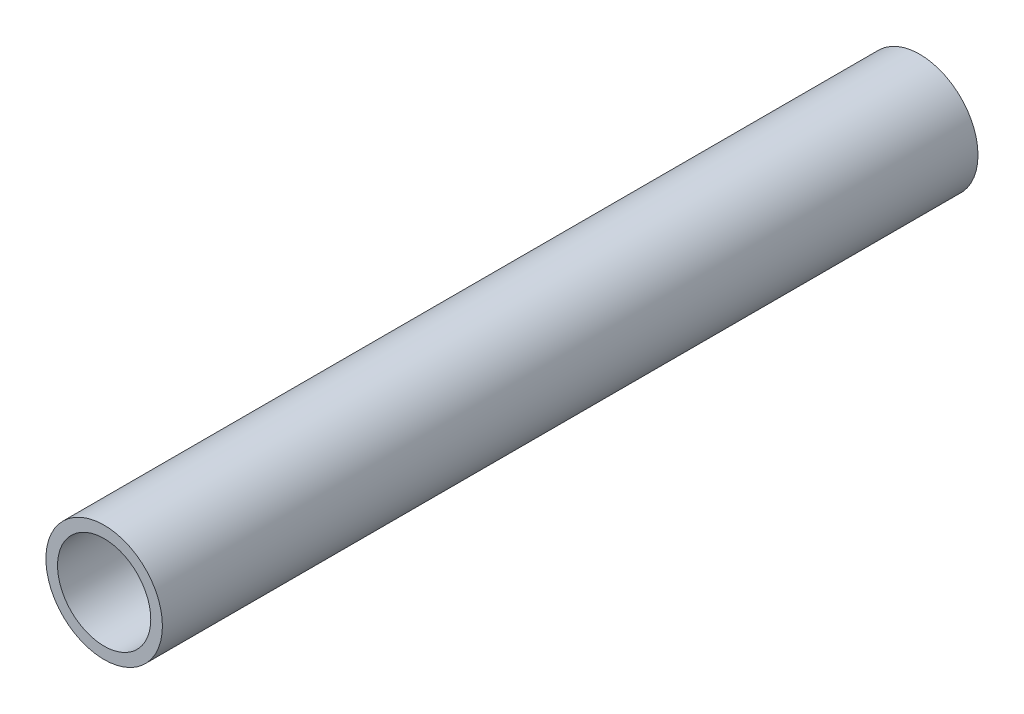
ISO-10303-21;
HEADER;
FILE_DESCRIPTION(('STEP AP214'),'2;1');
FILE_NAME('part.step','',(''),(''),'','','');
FILE_SCHEMA(('AUTOMOTIVE_DESIGN { 1 0 10303 214 1 1 1 1 }'));
ENDSEC;
DATA;
#1=APPLICATION_CONTEXT('core data for automotive mechanical design processes');
#2=APPLICATION_PROTOCOL_DEFINITION('international standard','automotive_design',2000,#1);
#3=PRODUCT_CONTEXT('',#1,'mechanical');
#4=PRODUCT('Part','Part','',(#3));
#5=PRODUCT_RELATED_PRODUCT_CATEGORY('part','',(#4));
#6=PRODUCT_DEFINITION_FORMATION('','',#4);
#7=PRODUCT_DEFINITION_CONTEXT('part definition',#1,'design');
#8=PRODUCT_DEFINITION('design','',#6,#7);
#9=PRODUCT_DEFINITION_SHAPE('','',#8);
#10=(LENGTH_UNIT() NAMED_UNIT(*) SI_UNIT(.MILLI.,.METRE.));
#11=(NAMED_UNIT(*) PLANE_ANGLE_UNIT() SI_UNIT($,.RADIAN.));
#12=(NAMED_UNIT(*) SI_UNIT($,.STERADIAN.) SOLID_ANGLE_UNIT());
#13=UNCERTAINTY_MEASURE_WITH_UNIT(LENGTH_MEASURE(1.E-05),#10,'distance_accuracy_value','');
#14=(GEOMETRIC_REPRESENTATION_CONTEXT(3) GLOBAL_UNCERTAINTY_ASSIGNED_CONTEXT((#13)) GLOBAL_UNIT_ASSIGNED_CONTEXT((#10,
#11,#12)) REPRESENTATION_CONTEXT('',''));
#15=CARTESIAN_POINT('',(0.,0.,0.));
#16=DIRECTION('',(0.,0.,1.));
#17=DIRECTION('',(1.,0.,0.));
#18=AXIS2_PLACEMENT_3D('',#15,#16,#17);
#19=CARTESIAN_POINT('',(0.,0.,87.5));
#20=DIRECTION('',(0.,0.,1.));
#21=DIRECTION('',(1.,0.,0.));
#22=AXIS2_PLACEMENT_3D('',#19,#20,#21);
#23=PLANE('',#22);
#24=CARTESIAN_POINT('',(0.,0.,87.5));
#25=DIRECTION('',(0.,0.,1.));
#26=DIRECTION('',(1.,0.,0.));
#27=AXIS2_PLACEMENT_3D('',#24,#25,#26);
#28=CIRCLE('',#27,12.5);
#29=CARTESIAN_POINT('',(12.5,0.,87.5));
#30=VERTEX_POINT('',#29);
#31=EDGE_CURVE('E10',#30,#30,#28,.T.);
#32=ORIENTED_EDGE('',*,*,#31,.T.);
#33=EDGE_LOOP('',(#32));
#34=FACE_BOUND('',#33,.T.);
#35=CARTESIAN_POINT('',(0.,0.,87.5));
#36=DIRECTION('',(0.,0.,1.));
#37=DIRECTION('',(1.,0.,0.));
#38=AXIS2_PLACEMENT_3D('',#35,#36,#37);
#39=CIRCLE('',#38,10.);
#40=CARTESIAN_POINT('',(10.,0.,87.5));
#41=VERTEX_POINT('',#40);
#42=EDGE_CURVE('E54',#41,#41,#39,.T.);
#43=ORIENTED_EDGE('',*,*,#42,.F.);
#44=EDGE_LOOP('',(#43));
#45=FACE_BOUND('',#44,.T.);
#46=ADVANCED_FACE('F41',(#34,#45),#23,.T.);
#47=CARTESIAN_POINT('',(0.,0.,-87.5));
#48=DIRECTION('',(0.,0.,1.));
#49=DIRECTION('',(1.,0.,0.));
#50=AXIS2_PLACEMENT_3D('',#47,#48,#49);
#51=PLANE('',#50);
#52=CARTESIAN_POINT('',(0.,0.,-87.5));
#53=DIRECTION('',(0.,0.,1.));
#54=DIRECTION('',(1.,0.,0.));
#55=AXIS2_PLACEMENT_3D('',#52,#53,#54);
#56=CIRCLE('',#55,12.5);
#57=CARTESIAN_POINT('',(12.5,0.,-87.5));
#58=VERTEX_POINT('',#57);
#59=EDGE_CURVE('E45',#58,#58,#56,.T.);
#60=ORIENTED_EDGE('',*,*,#59,.F.);
#61=EDGE_LOOP('',(#60));
#62=FACE_BOUND('',#61,.T.);
#63=CARTESIAN_POINT('',(0.,0.,-87.5));
#64=DIRECTION('',(0.,0.,1.));
#65=DIRECTION('',(1.,0.,0.));
#66=AXIS2_PLACEMENT_3D('',#63,#64,#65);
#67=CIRCLE('',#66,10.);
#68=CARTESIAN_POINT('',(10.,0.,-87.5));
#69=VERTEX_POINT('',#68);
#70=EDGE_CURVE('E56',#69,#69,#67,.T.);
#71=ORIENTED_EDGE('',*,*,#70,.T.);
#72=EDGE_LOOP('',(#71));
#73=FACE_BOUND('',#72,.T.);
#74=ADVANCED_FACE('F68',(#62,#73),#51,.F.);
#75=CARTESIAN_POINT('',(0.,0.,87.5));
#76=DIRECTION('',(0.,0.,-1.));
#77=DIRECTION('',(-1.,0.,0.));
#78=AXIS2_PLACEMENT_3D('',#75,#76,#77);
#79=CYLINDRICAL_SURFACE('',#78,12.5);
#80=ORIENTED_EDGE('',*,*,#31,.F.);
#81=EDGE_LOOP('',(#80));
#82=FACE_BOUND('',#81,.T.);
#83=ORIENTED_EDGE('',*,*,#59,.T.);
#84=EDGE_LOOP('',(#83));
#85=FACE_BOUND('',#84,.T.);
#86=ADVANCED_FACE('F43',(#82,#85),#79,.T.);
#87=CARTESIAN_POINT('',(0.,0.,87.5));
#88=DIRECTION('',(0.,0.,-1.));
#89=DIRECTION('',(-1.,0.,0.));
#90=AXIS2_PLACEMENT_3D('',#87,#88,#89);
#91=CYLINDRICAL_SURFACE('',#90,10.);
#92=ORIENTED_EDGE('',*,*,#42,.T.);
#93=EDGE_LOOP('',(#92));
#94=FACE_BOUND('',#93,.T.);
#95=ORIENTED_EDGE('',*,*,#70,.F.);
#96=EDGE_LOOP('',(#95));
#97=FACE_BOUND('',#96,.T.);
#98=ADVANCED_FACE('F64',(#94,#97),#91,.F.);
#99=CLOSED_SHELL('',(#46,#74,#86,#98));
#100=MANIFOLD_SOLID_BREP('B2',#99);
#101=ADVANCED_BREP_SHAPE_REPRESENTATION('',(#18,#100),#14);
#102=SHAPE_DEFINITION_REPRESENTATION(#9,#101);
ENDSEC;
END-ISO-10303-21;
